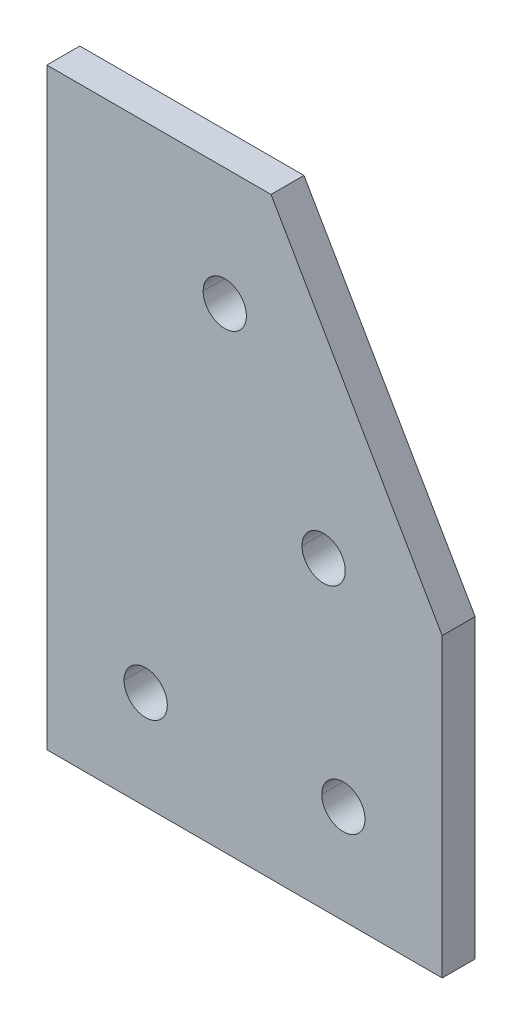
ISO-10303-21;
HEADER;
FILE_DESCRIPTION(('STEP AP214'),'2;1');
FILE_NAME('part.step','',(''),(''),'','','');
FILE_SCHEMA(('AUTOMOTIVE_DESIGN { 1 0 10303 214 1 1 1 1 }'));
ENDSEC;
DATA;
#1=APPLICATION_CONTEXT('core data for automotive mechanical design processes');
#2=APPLICATION_PROTOCOL_DEFINITION('international standard','automotive_design',2000,#1);
#3=PRODUCT_CONTEXT('',#1,'mechanical');
#4=PRODUCT('Part','Part','',(#3));
#5=PRODUCT_RELATED_PRODUCT_CATEGORY('part','',(#4));
#6=PRODUCT_DEFINITION_FORMATION('','',#4);
#7=PRODUCT_DEFINITION_CONTEXT('part definition',#1,'design');
#8=PRODUCT_DEFINITION('design','',#6,#7);
#9=PRODUCT_DEFINITION_SHAPE('','',#8);
#10=(LENGTH_UNIT() NAMED_UNIT(*) SI_UNIT(.MILLI.,.METRE.));
#11=(NAMED_UNIT(*) PLANE_ANGLE_UNIT() SI_UNIT($,.RADIAN.));
#12=(NAMED_UNIT(*) SI_UNIT($,.STERADIAN.) SOLID_ANGLE_UNIT());
#13=UNCERTAINTY_MEASURE_WITH_UNIT(LENGTH_MEASURE(1.E-05),#10,'distance_accuracy_value','');
#14=(GEOMETRIC_REPRESENTATION_CONTEXT(3) GLOBAL_UNCERTAINTY_ASSIGNED_CONTEXT((#13)) GLOBAL_UNIT_ASSIGNED_CONTEXT((#10,
#11,#12)) REPRESENTATION_CONTEXT('',''));
#15=CARTESIAN_POINT('',(0.,0.,0.));
#16=DIRECTION('',(0.,0.,1.));
#17=DIRECTION('',(1.,0.,0.));
#18=AXIS2_PLACEMENT_3D('',#15,#16,#17);
#19=CARTESIAN_POINT('',(-38.1,57.15,-3.175));
#20=DIRECTION('',(0.,-1.,0.));
#21=DIRECTION('',(0.,0.,1.));
#22=AXIS2_PLACEMENT_3D('',#19,#20,#21);
#23=PLANE('',#22);
#24=DIRECTION('',(1.,0.,0.));
#25=VECTOR('',#24,1.);
#26=CARTESIAN_POINT('',(-38.1,57.15,3.175));
#27=LINE('',#26,#25);
#28=CARTESIAN_POINT('',(-38.1,57.15,3.175));
#29=VERTEX_POINT('',#28);
#30=CARTESIAN_POINT('',(5.1054,57.15,3.175));
#31=VERTEX_POINT('',#30);
#32=EDGE_CURVE('E11',#29,#31,#27,.T.);
#33=ORIENTED_EDGE('',*,*,#32,.T.);
#34=DIRECTION('',(0.,0.,1.));
#35=VECTOR('',#34,1.);
#36=CARTESIAN_POINT('',(5.1054,57.15,-3.175));
#37=LINE('',#36,#35);
#38=CARTESIAN_POINT('',(5.1054,57.15,-3.175));
#39=VERTEX_POINT('',#38);
#40=EDGE_CURVE('E24',#39,#31,#37,.T.);
#41=ORIENTED_EDGE('',*,*,#40,.F.);
#42=DIRECTION('',(1.,0.,0.));
#43=VECTOR('',#42,1.);
#44=CARTESIAN_POINT('',(-38.1,57.15,-3.175));
#45=LINE('',#44,#43);
#46=CARTESIAN_POINT('',(-38.1,57.15,-3.175));
#47=VERTEX_POINT('',#46);
#48=EDGE_CURVE('E308',#47,#39,#45,.T.);
#49=ORIENTED_EDGE('',*,*,#48,.F.);
#50=DIRECTION('',(0.,0.,1.));
#51=VECTOR('',#50,1.);
#52=CARTESIAN_POINT('',(-38.1,57.15,-3.175));
#53=LINE('',#52,#51);
#54=EDGE_CURVE('E304',#47,#29,#53,.T.);
#55=ORIENTED_EDGE('',*,*,#54,.T.);
#56=EDGE_LOOP('',(#33,#41,#49,#55));
#57=FACE_BOUND('',#56,.T.);
#58=ADVANCED_FACE('F16',(#57),#23,.F.);
#59=CARTESIAN_POINT('',(-38.1,-57.15,-3.175));
#60=DIRECTION('',(1.,0.,0.));
#61=DIRECTION('',(0.,0.,-1.));
#62=AXIS2_PLACEMENT_3D('',#59,#60,#61);
#63=PLANE('',#62);
#64=DIRECTION('',(0.,1.,0.));
#65=VECTOR('',#64,1.);
#66=CARTESIAN_POINT('',(-38.1,-57.15,3.175));
#67=LINE('',#66,#65);
#68=CARTESIAN_POINT('',(-38.1,-57.15,3.175));
#69=VERTEX_POINT('',#68);
#70=EDGE_CURVE('E299',#69,#29,#67,.T.);
#71=ORIENTED_EDGE('',*,*,#70,.T.);
#72=ORIENTED_EDGE('',*,*,#54,.F.);
#73=DIRECTION('',(0.,1.,0.));
#74=VECTOR('',#73,1.);
#75=CARTESIAN_POINT('',(-38.1,-57.15,-3.175));
#76=LINE('',#75,#74);
#77=CARTESIAN_POINT('',(-38.1,-57.15,-3.175));
#78=VERTEX_POINT('',#77);
#79=EDGE_CURVE('E294',#78,#47,#76,.T.);
#80=ORIENTED_EDGE('',*,*,#79,.F.);
#81=DIRECTION('',(0.,0.,1.));
#82=VECTOR('',#81,1.);
#83=CARTESIAN_POINT('',(-38.1,-57.15,-3.175));
#84=LINE('',#83,#82);
#85=EDGE_CURVE('E290',#78,#69,#84,.T.);
#86=ORIENTED_EDGE('',*,*,#85,.T.);
#87=EDGE_LOOP('',(#71,#72,#80,#86));
#88=FACE_BOUND('',#87,.T.);
#89=ADVANCED_FACE('F332',(#88),#63,.F.);
#90=CARTESIAN_POINT('',(38.1,-57.15,-3.175));
#91=DIRECTION('',(0.,1.,0.));
#92=DIRECTION('',(0.,0.,-1.));
#93=AXIS2_PLACEMENT_3D('',#90,#91,#92);
#94=PLANE('',#93);
#95=DIRECTION('',(-1.,0.,0.));
#96=VECTOR('',#95,1.);
#97=CARTESIAN_POINT('',(38.1,-57.15,3.175));
#98=LINE('',#97,#96);
#99=CARTESIAN_POINT('',(38.1,-57.15,3.175));
#100=VERTEX_POINT('',#99);
#101=EDGE_CURVE('E285',#100,#69,#98,.T.);
#102=ORIENTED_EDGE('',*,*,#101,.T.);
#103=ORIENTED_EDGE('',*,*,#85,.F.);
#104=DIRECTION('',(-1.,0.,0.));
#105=VECTOR('',#104,1.);
#106=CARTESIAN_POINT('',(38.1,-57.15,-3.175));
#107=LINE('',#106,#105);
#108=CARTESIAN_POINT('',(38.1,-57.15,-3.175));
#109=VERTEX_POINT('',#108);
#110=EDGE_CURVE('E280',#109,#78,#107,.T.);
#111=ORIENTED_EDGE('',*,*,#110,.F.);
#112=DIRECTION('',(0.,0.,1.));
#113=VECTOR('',#112,1.);
#114=CARTESIAN_POINT('',(38.1,-57.15,-3.175));
#115=LINE('',#114,#113);
#116=EDGE_CURVE('E276',#109,#100,#115,.T.);
#117=ORIENTED_EDGE('',*,*,#116,.T.);
#118=EDGE_LOOP('',(#102,#103,#111,#117));
#119=FACE_BOUND('',#118,.T.);
#120=ADVANCED_FACE('F335',(#119),#94,.F.);
#121=CARTESIAN_POINT('',(38.1,0.,-3.175));
#122=DIRECTION('',(-1.,0.,0.));
#123=DIRECTION('',(0.,0.,1.));
#124=AXIS2_PLACEMENT_3D('',#121,#122,#123);
#125=PLANE('',#124);
#126=DIRECTION('',(0.,-1.,0.));
#127=VECTOR('',#126,1.);
#128=CARTESIAN_POINT('',(38.1,0.,3.175));
#129=LINE('',#128,#127);
#130=CARTESIAN_POINT('',(38.1,0.,3.175));
#131=VERTEX_POINT('',#130);
#132=EDGE_CURVE('E271',#131,#100,#129,.T.);
#133=ORIENTED_EDGE('',*,*,#132,.T.);
#134=ORIENTED_EDGE('',*,*,#116,.F.);
#135=DIRECTION('',(0.,-1.,0.));
#136=VECTOR('',#135,1.);
#137=CARTESIAN_POINT('',(38.1,0.,-3.175));
#138=LINE('',#137,#136);
#139=CARTESIAN_POINT('',(38.1,0.,-3.175));
#140=VERTEX_POINT('',#139);
#141=EDGE_CURVE('E266',#140,#109,#138,.T.);
#142=ORIENTED_EDGE('',*,*,#141,.F.);
#143=DIRECTION('',(0.,0.,1.));
#144=VECTOR('',#143,1.);
#145=CARTESIAN_POINT('',(38.1,0.,-3.175));
#146=LINE('',#145,#144);
#147=EDGE_CURVE('E262',#140,#131,#146,.T.);
#148=ORIENTED_EDGE('',*,*,#147,.T.);
#149=EDGE_LOOP('',(#133,#134,#142,#148));
#150=FACE_BOUND('',#149,.T.);
#151=ADVANCED_FACE('F327',(#150),#125,.F.);
#152=CARTESIAN_POINT('',(5.1054,57.15,-3.175));
#153=DIRECTION('',(-0.86603175470726,-0.499988999717658,0.));
#154=DIRECTION('',(-0.499988999717658,0.86603175470726,0.));
#155=AXIS2_PLACEMENT_3D('',#152,#153,#154);
#156=PLANE('',#155);
#157=DIRECTION('',(0.499988999717658,-0.86603175470726,0.));
#158=VECTOR('',#157,1.);
#159=CARTESIAN_POINT('',(5.1054,57.15,3.175));
#160=LINE('',#159,#158);
#161=EDGE_CURVE('E257',#31,#131,#160,.T.);
#162=ORIENTED_EDGE('',*,*,#161,.T.);
#163=ORIENTED_EDGE('',*,*,#147,.F.);
#164=DIRECTION('',(0.499988999717658,-0.86603175470726,0.));
#165=VECTOR('',#164,1.);
#166=CARTESIAN_POINT('',(5.1054,57.15,-3.175));
#167=LINE('',#166,#165);
#168=EDGE_CURVE('E252',#39,#140,#167,.T.);
#169=ORIENTED_EDGE('',*,*,#168,.F.);
#170=ORIENTED_EDGE('',*,*,#40,.T.);
#171=EDGE_LOOP('',(#162,#163,#169,#170));
#172=FACE_BOUND('',#171,.T.);
#173=ADVANCED_FACE('F319',(#172),#156,.F.);
#174=CARTESIAN_POINT('',(0.,-57.15,-3.175));
#175=DIRECTION('',(0.,0.,-1.));
#176=DIRECTION('',(-1.,0.,0.));
#177=AXIS2_PLACEMENT_3D('',#174,#175,#176);
#178=PLANE('',#177);
#179=CARTESIAN_POINT('',(19.05,-38.1,-3.175));
#180=DIRECTION('',(0.,0.,-1.));
#181=DIRECTION('',(-1.,0.,0.));
#182=AXIS2_PLACEMENT_3D('',#179,#180,#181);
#183=CIRCLE('',#182,4.1656);
#184=CARTESIAN_POINT('',(14.8844,-38.1,-3.175));
#185=VERTEX_POINT('',#184);
#186=CARTESIAN_POINT('',(23.2156,-38.1,-3.175));
#187=VERTEX_POINT('',#186);
#188=EDGE_CURVE('E247',#185,#187,#183,.T.);
#189=ORIENTED_EDGE('',*,*,#188,.F.);
#190=CARTESIAN_POINT('',(19.05,-38.1,-3.175));
#191=DIRECTION('',(0.,0.,-1.));
#192=DIRECTION('',(-1.,0.,0.));
#193=AXIS2_PLACEMENT_3D('',#190,#191,#192);
#194=CIRCLE('',#193,4.1656);
#195=EDGE_CURVE('E242',#187,#185,#194,.T.);
#196=ORIENTED_EDGE('',*,*,#195,.F.);
#197=EDGE_LOOP('',(#189,#196));
#198=FACE_BOUND('',#197,.T.);
#199=CARTESIAN_POINT('',(15.24,1.47319999999999,-3.175));
#200=DIRECTION('',(0.,0.,-1.));
#201=DIRECTION('',(-1.,0.,0.));
#202=AXIS2_PLACEMENT_3D('',#199,#200,#201);
#203=CIRCLE('',#202,4.1656);
#204=CARTESIAN_POINT('',(11.0744,1.47319999999999,-3.175));
#205=VERTEX_POINT('',#204);
#206=CARTESIAN_POINT('',(19.4056,1.47319999999999,-3.175));
#207=VERTEX_POINT('',#206);
#208=EDGE_CURVE('E237',#205,#207,#203,.T.);
#209=ORIENTED_EDGE('',*,*,#208,.F.);
#210=CARTESIAN_POINT('',(15.24,1.47319999999999,-3.175));
#211=DIRECTION('',(0.,0.,-1.));
#212=DIRECTION('',(-1.,0.,0.));
#213=AXIS2_PLACEMENT_3D('',#210,#211,#212);
#214=CIRCLE('',#213,4.1656);
#215=EDGE_CURVE('E232',#207,#205,#214,.T.);
#216=ORIENTED_EDGE('',*,*,#215,.F.);
#217=EDGE_LOOP('',(#209,#216));
#218=FACE_BOUND('',#217,.T.);
#219=CARTESIAN_POINT('',(-3.81,34.4687678841869,-3.175));
#220=DIRECTION('',(0.,0.,-1.));
#221=DIRECTION('',(-1.,0.,0.));
#222=AXIS2_PLACEMENT_3D('',#219,#220,#221);
#223=CIRCLE('',#222,4.1656);
#224=CARTESIAN_POINT('',(-7.9756,34.4687678841869,-3.175));
#225=VERTEX_POINT('',#224);
#226=CARTESIAN_POINT('',(0.3556,34.4687678841869,-3.175));
#227=VERTEX_POINT('',#226);
#228=EDGE_CURVE('E228',#225,#227,#223,.T.);
#229=ORIENTED_EDGE('',*,*,#228,.F.);
#230=CARTESIAN_POINT('',(-3.81,34.4687678841869,-3.175));
#231=DIRECTION('',(0.,0.,-1.));
#232=DIRECTION('',(-1.,0.,0.));
#233=AXIS2_PLACEMENT_3D('',#230,#231,#232);
#234=CIRCLE('',#233,4.1656);
#235=EDGE_CURVE('E121',#227,#225,#234,.T.);
#236=ORIENTED_EDGE('',*,*,#235,.F.);
#237=EDGE_LOOP('',(#229,#236));
#238=FACE_BOUND('',#237,.T.);
#239=CARTESIAN_POINT('',(-19.05,-38.1,-3.175));
#240=DIRECTION('',(0.,0.,-1.));
#241=DIRECTION('',(-1.,0.,0.));
#242=AXIS2_PLACEMENT_3D('',#239,#240,#241);
#243=CIRCLE('',#242,4.1656);
#244=CARTESIAN_POINT('',(-23.2156,-38.1,-3.175));
#245=VERTEX_POINT('',#244);
#246=CARTESIAN_POINT('',(-14.8844,-38.1,-3.175));
#247=VERTEX_POINT('',#246);
#248=EDGE_CURVE('E221',#245,#247,#243,.T.);
#249=ORIENTED_EDGE('',*,*,#248,.F.);
#250=CARTESIAN_POINT('',(-19.05,-38.1,-3.175));
#251=DIRECTION('',(0.,0.,-1.));
#252=DIRECTION('',(-1.,0.,0.));
#253=AXIS2_PLACEMENT_3D('',#250,#251,#252);
#254=CIRCLE('',#253,4.1656);
#255=EDGE_CURVE('E217',#247,#245,#254,.T.);
#256=ORIENTED_EDGE('',*,*,#255,.F.);
#257=EDGE_LOOP('',(#249,#256));
#258=FACE_BOUND('',#257,.T.);
#259=ORIENTED_EDGE('',*,*,#168,.T.);
#260=ORIENTED_EDGE('',*,*,#141,.T.);
#261=ORIENTED_EDGE('',*,*,#110,.T.);
#262=ORIENTED_EDGE('',*,*,#79,.T.);
#263=ORIENTED_EDGE('',*,*,#48,.T.);
#264=EDGE_LOOP('',(#259,#260,#261,#262,#263));
#265=FACE_BOUND('',#264,.T.);
#266=ADVANCED_FACE('F329',(#198,#218,#238,#258,#265),#178,.T.);
#267=CARTESIAN_POINT('',(-19.05,-38.1,-3.175));
#268=DIRECTION('',(0.,0.,-1.));
#269=DIRECTION('',(0.,1.,0.));
#270=AXIS2_PLACEMENT_3D('',#267,#268,#269);
#271=CYLINDRICAL_SURFACE('',#270,4.1656);
#272=CARTESIAN_POINT('',(-19.05,-38.1,3.175));
#273=DIRECTION('',(0.,0.,-1.));
#274=DIRECTION('',(-1.,0.,0.));
#275=AXIS2_PLACEMENT_3D('',#272,#273,#274);
#276=CIRCLE('',#275,4.1656);
#277=CARTESIAN_POINT('',(-14.8844,-38.1,3.175));
#278=VERTEX_POINT('',#277);
#279=CARTESIAN_POINT('',(-23.2156,-38.1,3.175));
#280=VERTEX_POINT('',#279);
#281=EDGE_CURVE('E214',#278,#280,#276,.T.);
#282=ORIENTED_EDGE('',*,*,#281,.F.);
#283=CARTESIAN_POINT('',(-14.8844,-38.1,3.175));
#284=DIRECTION('',(0.,0.,-1.));
#285=VECTOR('',#284,1.);
#286=LINE('',#283,#285);
#287=EDGE_CURVE('E191',#278,#247,#286,.T.);
#288=ORIENTED_EDGE('',*,*,#287,.T.);
#289=ORIENTED_EDGE('',*,*,#255,.T.);
#290=CARTESIAN_POINT('',(-23.2156,-38.1,3.175));
#291=DIRECTION('',(0.,0.,-1.));
#292=VECTOR('',#291,1.);
#293=LINE('',#290,#292);
#294=EDGE_CURVE('E204',#280,#245,#293,.T.);
#295=ORIENTED_EDGE('',*,*,#294,.F.);
#296=EDGE_LOOP('',(#282,#288,#289,#295));
#297=FACE_BOUND('',#296,.T.);
#298=ADVANCED_FACE('F169',(#297),#271,.F.);
#299=CARTESIAN_POINT('',(-19.05,-38.1,-3.175));
#300=DIRECTION('',(0.,0.,-1.));
#301=DIRECTION('',(0.,-1.,0.));
#302=AXIS2_PLACEMENT_3D('',#299,#300,#301);
#303=CYLINDRICAL_SURFACE('',#302,4.1656);
#304=ORIENTED_EDGE('',*,*,#248,.T.);
#305=ORIENTED_EDGE('',*,*,#287,.F.);
#306=CARTESIAN_POINT('',(-19.05,-38.1,3.175));
#307=DIRECTION('',(0.,0.,-1.));
#308=DIRECTION('',(-1.,0.,0.));
#309=AXIS2_PLACEMENT_3D('',#306,#307,#308);
#310=CIRCLE('',#309,4.1656);
#311=EDGE_CURVE('E150',#280,#278,#310,.T.);
#312=ORIENTED_EDGE('',*,*,#311,.F.);
#313=ORIENTED_EDGE('',*,*,#294,.T.);
#314=EDGE_LOOP('',(#304,#305,#312,#313));
#315=FACE_BOUND('',#314,.T.);
#316=ADVANCED_FACE('F159',(#315),#303,.F.);
#317=CARTESIAN_POINT('',(0.,-57.15,3.175));
#318=DIRECTION('',(0.,0.,-1.));
#319=DIRECTION('',(-1.,0.,0.));
#320=AXIS2_PLACEMENT_3D('',#317,#318,#319);
#321=PLANE('',#320);
#322=CARTESIAN_POINT('',(19.05,-38.1,3.175));
#323=DIRECTION('',(0.,0.,-1.));
#324=DIRECTION('',(-1.,0.,0.));
#325=AXIS2_PLACEMENT_3D('',#322,#323,#324);
#326=CIRCLE('',#325,4.1656);
#327=CARTESIAN_POINT('',(14.8844,-38.1,3.175));
#328=VERTEX_POINT('',#327);
#329=CARTESIAN_POINT('',(23.2156,-38.1,3.175));
#330=VERTEX_POINT('',#329);
#331=EDGE_CURVE('E146',#328,#330,#326,.T.);
#332=ORIENTED_EDGE('',*,*,#331,.T.);
#333=CARTESIAN_POINT('',(19.05,-38.1,3.175));
#334=DIRECTION('',(0.,0.,-1.));
#335=DIRECTION('',(-1.,0.,0.));
#336=AXIS2_PLACEMENT_3D('',#333,#334,#335);
#337=CIRCLE('',#336,4.1656);
#338=EDGE_CURVE('E142',#330,#328,#337,.T.);
#339=ORIENTED_EDGE('',*,*,#338,.T.);
#340=EDGE_LOOP('',(#332,#339));
#341=FACE_BOUND('',#340,.T.);
#342=CARTESIAN_POINT('',(15.24,1.47319999999999,3.175));
#343=DIRECTION('',(0.,0.,-1.));
#344=DIRECTION('',(-1.,0.,0.));
#345=AXIS2_PLACEMENT_3D('',#342,#343,#344);
#346=CIRCLE('',#345,4.1656);
#347=CARTESIAN_POINT('',(11.0744,1.47319999999999,3.175));
#348=VERTEX_POINT('',#347);
#349=CARTESIAN_POINT('',(19.4056,1.47319999999999,3.175));
#350=VERTEX_POINT('',#349);
#351=EDGE_CURVE('E132',#348,#350,#346,.T.);
#352=ORIENTED_EDGE('',*,*,#351,.T.);
#353=CARTESIAN_POINT('',(15.24,1.47319999999999,3.175));
#354=DIRECTION('',(0.,0.,-1.));
#355=DIRECTION('',(-1.,0.,0.));
#356=AXIS2_PLACEMENT_3D('',#353,#354,#355);
#357=CIRCLE('',#356,4.1656);
#358=EDGE_CURVE('E130',#350,#348,#357,.T.);
#359=ORIENTED_EDGE('',*,*,#358,.T.);
#360=EDGE_LOOP('',(#352,#359));
#361=FACE_BOUND('',#360,.T.);
#362=CARTESIAN_POINT('',(-3.81,34.4687678841869,3.175));
#363=DIRECTION('',(0.,0.,-1.));
#364=DIRECTION('',(-1.,0.,0.));
#365=AXIS2_PLACEMENT_3D('',#362,#363,#364);
#366=CIRCLE('',#365,4.1656);
#367=CARTESIAN_POINT('',(-7.9756,34.4687678841869,3.175));
#368=VERTEX_POINT('',#367);
#369=CARTESIAN_POINT('',(0.3556,34.4687678841869,3.175));
#370=VERTEX_POINT('',#369);
#371=EDGE_CURVE('E110',#368,#370,#366,.T.);
#372=ORIENTED_EDGE('',*,*,#371,.T.);
#373=CARTESIAN_POINT('',(-3.81,34.4687678841869,3.175));
#374=DIRECTION('',(0.,0.,-1.));
#375=DIRECTION('',(-1.,0.,0.));
#376=AXIS2_PLACEMENT_3D('',#373,#374,#375);
#377=CIRCLE('',#376,4.1656);
#378=EDGE_CURVE('E105',#370,#368,#377,.T.);
#379=ORIENTED_EDGE('',*,*,#378,.T.);
#380=EDGE_LOOP('',(#372,#379));
#381=FACE_BOUND('',#380,.T.);
#382=ORIENTED_EDGE('',*,*,#311,.T.);
#383=ORIENTED_EDGE('',*,*,#281,.T.);
#384=EDGE_LOOP('',(#382,#383));
#385=FACE_BOUND('',#384,.T.);
#386=ORIENTED_EDGE('',*,*,#161,.F.);
#387=ORIENTED_EDGE('',*,*,#32,.F.);
#388=ORIENTED_EDGE('',*,*,#70,.F.);
#389=ORIENTED_EDGE('',*,*,#101,.F.);
#390=ORIENTED_EDGE('',*,*,#132,.F.);
#391=EDGE_LOOP('',(#386,#387,#388,#389,#390));
#392=FACE_BOUND('',#391,.T.);
#393=ADVANCED_FACE('F107',(#341,#361,#381,#385,#392),#321,.F.);
#394=CARTESIAN_POINT('',(-3.81,34.4687678841869,-3.175));
#395=DIRECTION('',(0.,0.,-1.));
#396=DIRECTION('',(0.,1.,0.));
#397=AXIS2_PLACEMENT_3D('',#394,#395,#396);
#398=CYLINDRICAL_SURFACE('',#397,4.1656);
#399=ORIENTED_EDGE('',*,*,#378,.F.);
#400=CARTESIAN_POINT('',(0.3556,34.4687678841869,3.175));
#401=DIRECTION('',(0.,0.,-1.));
#402=VECTOR('',#401,1.);
#403=LINE('',#400,#402);
#404=EDGE_CURVE('E114',#370,#227,#403,.T.);
#405=ORIENTED_EDGE('',*,*,#404,.T.);
#406=ORIENTED_EDGE('',*,*,#235,.T.);
#407=CARTESIAN_POINT('',(-7.9756,34.4687678841869,3.175));
#408=DIRECTION('',(0.,0.,-1.));
#409=VECTOR('',#408,1.);
#410=LINE('',#407,#409);
#411=EDGE_CURVE('E118',#368,#225,#410,.T.);
#412=ORIENTED_EDGE('',*,*,#411,.F.);
#413=EDGE_LOOP('',(#399,#405,#406,#412));
#414=FACE_BOUND('',#413,.T.);
#415=ADVANCED_FACE('F120',(#414),#398,.F.);
#416=CARTESIAN_POINT('',(-3.81,34.4687678841869,-3.175));
#417=DIRECTION('',(0.,0.,-1.));
#418=DIRECTION('',(0.,-1.,0.));
#419=AXIS2_PLACEMENT_3D('',#416,#417,#418);
#420=CYLINDRICAL_SURFACE('',#419,4.1656);
#421=ORIENTED_EDGE('',*,*,#228,.T.);
#422=ORIENTED_EDGE('',*,*,#404,.F.);
#423=ORIENTED_EDGE('',*,*,#371,.F.);
#424=ORIENTED_EDGE('',*,*,#411,.T.);
#425=EDGE_LOOP('',(#421,#422,#423,#424));
#426=FACE_BOUND('',#425,.T.);
#427=ADVANCED_FACE('F128',(#426),#420,.F.);
#428=CARTESIAN_POINT('',(15.24,1.47319999999999,-3.175));
#429=DIRECTION('',(0.,0.,-1.));
#430=DIRECTION('',(0.,1.,0.));
#431=AXIS2_PLACEMENT_3D('',#428,#429,#430);
#432=CYLINDRICAL_SURFACE('',#431,4.1656);
#433=ORIENTED_EDGE('',*,*,#358,.F.);
#434=CARTESIAN_POINT('',(19.4056,1.47319999999999,3.175));
#435=DIRECTION('',(0.,0.,-1.));
#436=VECTOR('',#435,1.);
#437=LINE('',#434,#436);
#438=EDGE_CURVE('E125',#350,#207,#437,.T.);
#439=ORIENTED_EDGE('',*,*,#438,.T.);
#440=ORIENTED_EDGE('',*,*,#215,.T.);
#441=CARTESIAN_POINT('',(11.0744,1.47319999999999,3.175));
#442=DIRECTION('',(0.,0.,-1.));
#443=VECTOR('',#442,1.);
#444=LINE('',#441,#443);
#445=EDGE_CURVE('E525',#348,#205,#444,.T.);
#446=ORIENTED_EDGE('',*,*,#445,.F.);
#447=EDGE_LOOP('',(#433,#439,#440,#446));
#448=FACE_BOUND('',#447,.T.);
#449=ADVANCED_FACE('F453',(#448),#432,.F.);
#450=CARTESIAN_POINT('',(15.24,1.47319999999999,-3.175));
#451=DIRECTION('',(0.,0.,-1.));
#452=DIRECTION('',(0.,-1.,0.));
#453=AXIS2_PLACEMENT_3D('',#450,#451,#452);
#454=CYLINDRICAL_SURFACE('',#453,4.1656);
#455=ORIENTED_EDGE('',*,*,#208,.T.);
#456=ORIENTED_EDGE('',*,*,#438,.F.);
#457=ORIENTED_EDGE('',*,*,#351,.F.);
#458=ORIENTED_EDGE('',*,*,#445,.T.);
#459=EDGE_LOOP('',(#455,#456,#457,#458));
#460=FACE_BOUND('',#459,.T.);
#461=ADVANCED_FACE('F465',(#460),#454,.F.);
#462=CARTESIAN_POINT('',(19.05,-38.1,-3.175));
#463=DIRECTION('',(0.,0.,-1.));
#464=DIRECTION('',(0.,1.,0.));
#465=AXIS2_PLACEMENT_3D('',#462,#463,#464);
#466=CYLINDRICAL_SURFACE('',#465,4.1656);
#467=ORIENTED_EDGE('',*,*,#338,.F.);
#468=CARTESIAN_POINT('',(23.2156,-38.1,3.175));
#469=DIRECTION('',(0.,0.,-1.));
#470=VECTOR('',#469,1.);
#471=LINE('',#468,#470);
#472=EDGE_CURVE('E523',#330,#187,#471,.T.);
#473=ORIENTED_EDGE('',*,*,#472,.T.);
#474=ORIENTED_EDGE('',*,*,#195,.T.);
#475=CARTESIAN_POINT('',(14.8844,-38.1,3.175));
#476=DIRECTION('',(0.,0.,-1.));
#477=VECTOR('',#476,1.);
#478=LINE('',#475,#477);
#479=EDGE_CURVE('E519',#328,#185,#478,.T.);
#480=ORIENTED_EDGE('',*,*,#479,.F.);
#481=EDGE_LOOP('',(#467,#473,#474,#480));
#482=FACE_BOUND('',#481,.T.);
#483=ADVANCED_FACE('F477',(#482),#466,.F.);
#484=CARTESIAN_POINT('',(19.05,-38.1,-3.175));
#485=DIRECTION('',(0.,0.,-1.));
#486=DIRECTION('',(0.,-1.,0.));
#487=AXIS2_PLACEMENT_3D('',#484,#485,#486);
#488=CYLINDRICAL_SURFACE('',#487,4.1656);
#489=ORIENTED_EDGE('',*,*,#188,.T.);
#490=ORIENTED_EDGE('',*,*,#472,.F.);
#491=ORIENTED_EDGE('',*,*,#331,.F.);
#492=ORIENTED_EDGE('',*,*,#479,.T.);
#493=EDGE_LOOP('',(#489,#490,#491,#492));
#494=FACE_BOUND('',#493,.T.);
#495=ADVANCED_FACE('F357',(#494),#488,.F.);
#496=CLOSED_SHELL('',(#58,#89,#120,#151,#173,#266,#298,#316,#393,#415,#427,#449,#461,#483,#495));
#497=MANIFOLD_SOLID_BREP('B1',#496);
#498=ADVANCED_BREP_SHAPE_REPRESENTATION('',(#18,#497),#14);
#499=SHAPE_DEFINITION_REPRESENTATION(#9,#498);
ENDSEC;
END-ISO-10303-21;
